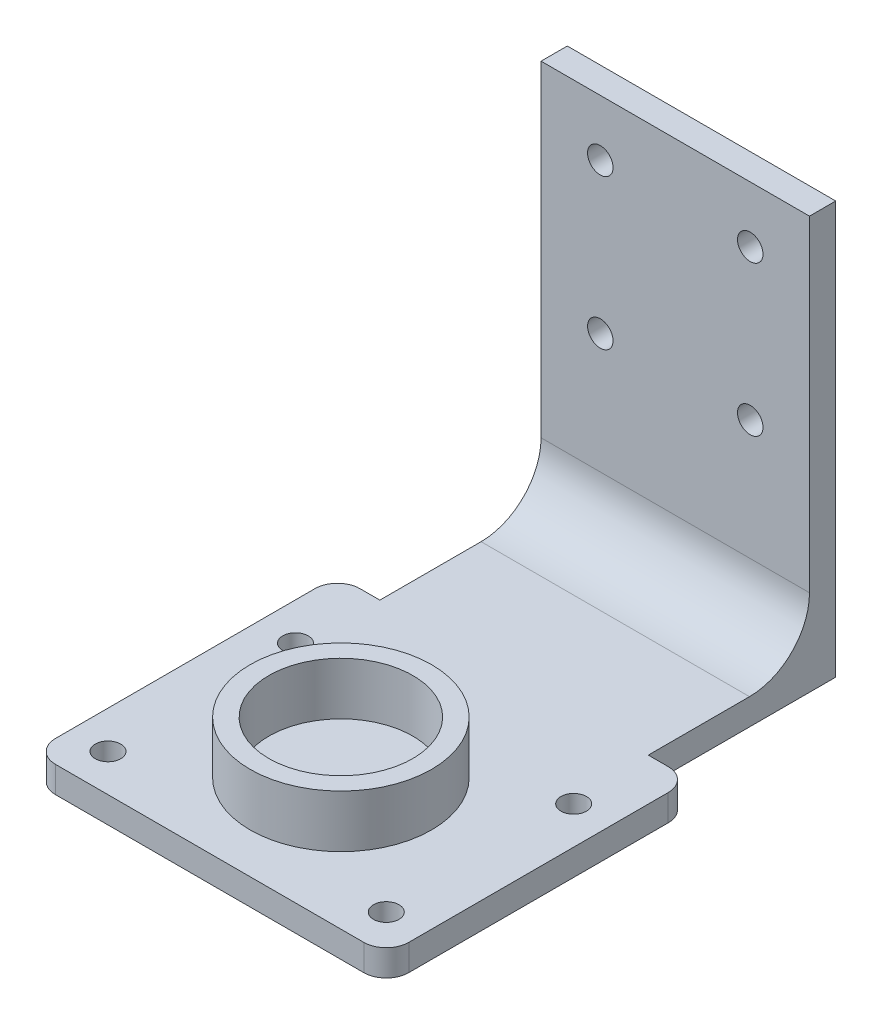
ISO-10303-21;
HEADER;
FILE_DESCRIPTION(('STEP AP214'),'2;1');
FILE_NAME('part.step','',(''),(''),'','','');
FILE_SCHEMA(('AUTOMOTIVE_DESIGN { 1 0 10303 214 1 1 1 1 }'));
ENDSEC;
DATA;
#1=APPLICATION_CONTEXT('core data for automotive mechanical design processes');
#2=APPLICATION_PROTOCOL_DEFINITION('international standard','automotive_design',2000,#1);
#3=PRODUCT_CONTEXT('',#1,'mechanical');
#4=PRODUCT('Part','Part','',(#3));
#5=PRODUCT_RELATED_PRODUCT_CATEGORY('part','',(#4));
#6=PRODUCT_DEFINITION_FORMATION('','',#4);
#7=PRODUCT_DEFINITION_CONTEXT('part definition',#1,'design');
#8=PRODUCT_DEFINITION('design','',#6,#7);
#9=PRODUCT_DEFINITION_SHAPE('','',#8);
#10=(LENGTH_UNIT() NAMED_UNIT(*) SI_UNIT(.MILLI.,.METRE.));
#11=(NAMED_UNIT(*) PLANE_ANGLE_UNIT() SI_UNIT($,.RADIAN.));
#12=(NAMED_UNIT(*) SI_UNIT($,.STERADIAN.) SOLID_ANGLE_UNIT());
#13=UNCERTAINTY_MEASURE_WITH_UNIT(LENGTH_MEASURE(1.E-05),#10,'distance_accuracy_value','');
#14=(GEOMETRIC_REPRESENTATION_CONTEXT(3) GLOBAL_UNCERTAINTY_ASSIGNED_CONTEXT((#13)) GLOBAL_UNIT_ASSIGNED_CONTEXT((#10,
#11,#12)) REPRESENTATION_CONTEXT('',''));
#15=CARTESIAN_POINT('',(0.,0.,0.));
#16=DIRECTION('',(0.,0.,1.));
#17=DIRECTION('',(1.,0.,0.));
#18=AXIS2_PLACEMENT_3D('',#15,#16,#17);
#19=CARTESIAN_POINT('',(0.,3.5,0.));
#20=DIRECTION('',(0.,-1.,0.));
#21=DIRECTION('',(0.,0.,-1.));
#22=AXIS2_PLACEMENT_3D('',#19,#20,#21);
#23=PLANE('',#22);
#24=CARTESIAN_POINT('',(0.,3.5,0.));
#25=DIRECTION('',(0.,-1.,0.));
#26=DIRECTION('',(0.,0.,-1.));
#27=AXIS2_PLACEMENT_3D('',#24,#25,#26);
#28=CIRCLE('',#27,12.1);
#29=CARTESIAN_POINT('',(0.,3.5,-12.1));
#30=VERTEX_POINT('',#29);
#31=EDGE_CURVE('E270',#30,#30,#28,.F.);
#32=ORIENTED_EDGE('',*,*,#31,.F.);
#33=EDGE_LOOP('',(#32));
#34=FACE_BOUND('',#33,.T.);
#35=DIRECTION('',(0.,0.,-1.));
#36=VECTOR('',#35,1.);
#37=CARTESIAN_POINT('',(17.9,3.5,0.));
#38=LINE('',#37,#36);
#39=CARTESIAN_POINT('',(17.9,3.5,-23.1));
#40=VERTEX_POINT('',#39);
#41=CARTESIAN_POINT('',(17.9,3.5,-36.6));
#42=VERTEX_POINT('',#41);
#43=EDGE_CURVE('E148',#40,#42,#38,.T.);
#44=ORIENTED_EDGE('',*,*,#43,.T.);
#45=DIRECTION('',(-1.,0.,0.));
#46=VECTOR('',#45,1.);
#47=CARTESIAN_POINT('',(0.,3.5,-36.6));
#48=LINE('',#47,#46);
#49=CARTESIAN_POINT('',(-17.9,3.5,-36.6));
#50=VERTEX_POINT('',#49);
#51=EDGE_CURVE('E315',#42,#50,#48,.T.);
#52=ORIENTED_EDGE('',*,*,#51,.T.);
#53=DIRECTION('',(0.,0.,1.));
#54=VECTOR('',#53,1.);
#55=CARTESIAN_POINT('',(-17.9,3.5,0.));
#56=LINE('',#55,#54);
#57=CARTESIAN_POINT('',(-17.9,3.5,-23.1));
#58=VERTEX_POINT('',#57);
#59=EDGE_CURVE('E190',#50,#58,#56,.T.);
#60=ORIENTED_EDGE('',*,*,#59,.T.);
#61=DIRECTION('',(-1.,0.,0.));
#62=VECTOR('',#61,1.);
#63=CARTESIAN_POINT('',(0.,3.5,-23.1));
#64=LINE('',#63,#62);
#65=CARTESIAN_POINT('',(-20.555,3.5,-23.1));
#66=VERTEX_POINT('',#65);
#67=EDGE_CURVE('E192',#58,#66,#64,.T.);
#68=ORIENTED_EDGE('',*,*,#67,.T.);
#69=CARTESIAN_POINT('',(-20.555,3.5,-20.1));
#70=DIRECTION('',(0.,-1.,0.));
#71=DIRECTION('',(0.,0.,-1.));
#72=AXIS2_PLACEMENT_3D('',#69,#70,#71);
#73=CIRCLE('',#72,3.);
#74=CARTESIAN_POINT('',(-23.555,3.5,-20.1));
#75=VERTEX_POINT('',#74);
#76=EDGE_CURVE('E288',#66,#75,#73,.F.);
#77=ORIENTED_EDGE('',*,*,#76,.T.);
#78=DIRECTION('',(0.,0.,1.));
#79=VECTOR('',#78,1.);
#80=CARTESIAN_POINT('',(-23.555,3.5,-17.5));
#81=LINE('',#80,#79);
#82=CARTESIAN_POINT('',(-23.555,3.5,14.5));
#83=VERTEX_POINT('',#82);
#84=EDGE_CURVE('E260',#75,#83,#81,.T.);
#85=ORIENTED_EDGE('',*,*,#84,.T.);
#86=CARTESIAN_POINT('',(-20.555,3.5,14.5));
#87=DIRECTION('',(0.,-1.,0.));
#88=DIRECTION('',(0.,0.,-1.));
#89=AXIS2_PLACEMENT_3D('',#86,#87,#88);
#90=CIRCLE('',#89,3.);
#91=CARTESIAN_POINT('',(-20.555,3.5,17.5));
#92=VERTEX_POINT('',#91);
#93=EDGE_CURVE('E286',#83,#92,#90,.F.);
#94=ORIENTED_EDGE('',*,*,#93,.T.);
#95=DIRECTION('',(1.,0.,0.));
#96=VECTOR('',#95,1.);
#97=CARTESIAN_POINT('',(-23.555,3.5,17.5));
#98=LINE('',#97,#96);
#99=CARTESIAN_POINT('',(20.555,3.5,17.5));
#100=VERTEX_POINT('',#99);
#101=EDGE_CURVE('E263',#92,#100,#98,.T.);
#102=ORIENTED_EDGE('',*,*,#101,.T.);
#103=CARTESIAN_POINT('',(20.555,3.5,14.5));
#104=DIRECTION('',(0.,-1.,0.));
#105=DIRECTION('',(0.,0.,-1.));
#106=AXIS2_PLACEMENT_3D('',#103,#104,#105);
#107=CIRCLE('',#106,3.);
#108=CARTESIAN_POINT('',(23.555,3.5,14.5));
#109=VERTEX_POINT('',#108);
#110=EDGE_CURVE('E290',#100,#109,#107,.F.);
#111=ORIENTED_EDGE('',*,*,#110,.T.);
#112=DIRECTION('',(0.,0.,-1.));
#113=VECTOR('',#112,1.);
#114=CARTESIAN_POINT('',(23.555,3.5,-17.5));
#115=LINE('',#114,#113);
#116=CARTESIAN_POINT('',(23.555,3.5,-20.1));
#117=VERTEX_POINT('',#116);
#118=EDGE_CURVE('E267',#109,#117,#115,.T.);
#119=ORIENTED_EDGE('',*,*,#118,.T.);
#120=CARTESIAN_POINT('',(20.555,3.5,-20.1));
#121=DIRECTION('',(0.,-1.,0.));
#122=DIRECTION('',(0.,0.,-1.));
#123=AXIS2_PLACEMENT_3D('',#120,#121,#122);
#124=CIRCLE('',#123,3.);
#125=CARTESIAN_POINT('',(20.555,3.5,-23.1));
#126=VERTEX_POINT('',#125);
#127=EDGE_CURVE('E292',#117,#126,#124,.F.);
#128=ORIENTED_EDGE('',*,*,#127,.T.);
#129=DIRECTION('',(-1.,0.,0.));
#130=VECTOR('',#129,1.);
#131=CARTESIAN_POINT('',(0.,3.5,-23.1));
#132=LINE('',#131,#130);
#133=EDGE_CURVE('E174',#126,#40,#132,.T.);
#134=ORIENTED_EDGE('',*,*,#133,.T.);
#135=EDGE_LOOP('',(#44,#52,#60,#68,#77,#85,#94,#102,#111,#119,#128,#134));
#136=FACE_BOUND('',#135,.T.);
#137=CARTESIAN_POINT('',(-18.555,3.5,12.5));
#138=DIRECTION('',(0.,1.,0.));
#139=DIRECTION('',(0.,0.,1.));
#140=AXIS2_PLACEMENT_3D('',#137,#138,#139);
#141=CIRCLE('',#140,1.7);
#142=CARTESIAN_POINT('',(-18.555,3.5,14.2));
#143=VERTEX_POINT('',#142);
#144=EDGE_CURVE('E254',#143,#143,#141,.T.);
#145=ORIENTED_EDGE('',*,*,#144,.F.);
#146=EDGE_LOOP('',(#145));
#147=FACE_BOUND('',#146,.T.);
#148=CARTESIAN_POINT('',(-18.555,3.5,-12.5));
#149=DIRECTION('',(0.,1.,0.));
#150=DIRECTION('',(0.,0.,-1.));
#151=AXIS2_PLACEMENT_3D('',#148,#149,#150);
#152=CIRCLE('',#151,1.7);
#153=CARTESIAN_POINT('',(-18.555,3.5,-14.2));
#154=VERTEX_POINT('',#153);
#155=EDGE_CURVE('E248',#154,#154,#152,.T.);
#156=ORIENTED_EDGE('',*,*,#155,.F.);
#157=EDGE_LOOP('',(#156));
#158=FACE_BOUND('',#157,.T.);
#159=CARTESIAN_POINT('',(18.555,3.5,12.5));
#160=DIRECTION('',(0.,1.,0.));
#161=DIRECTION('',(0.,0.,-1.));
#162=AXIS2_PLACEMENT_3D('',#159,#160,#161);
#163=CIRCLE('',#162,1.7);
#164=CARTESIAN_POINT('',(18.555,3.5,10.8));
#165=VERTEX_POINT('',#164);
#166=EDGE_CURVE('E242',#165,#165,#163,.T.);
#167=ORIENTED_EDGE('',*,*,#166,.F.);
#168=EDGE_LOOP('',(#167));
#169=FACE_BOUND('',#168,.T.);
#170=CARTESIAN_POINT('',(18.555,3.5,-12.5));
#171=DIRECTION('',(0.,1.,0.));
#172=DIRECTION('',(0.,0.,1.));
#173=AXIS2_PLACEMENT_3D('',#170,#171,#172);
#174=CIRCLE('',#173,1.7);
#175=CARTESIAN_POINT('',(18.555,3.5,-10.8));
#176=VERTEX_POINT('',#175);
#177=EDGE_CURVE('E236',#176,#176,#174,.T.);
#178=ORIENTED_EDGE('',*,*,#177,.F.);
#179=EDGE_LOOP('',(#178));
#180=FACE_BOUND('',#179,.T.);
#181=ADVANCED_FACE('F35',(#34,#136,#147,#158,#169,#180),#23,.F.);
#182=CARTESIAN_POINT('',(0.,0.,0.));
#183=DIRECTION('',(0.,-1.,0.));
#184=DIRECTION('',(0.,0.,-1.));
#185=AXIS2_PLACEMENT_3D('',#182,#183,#184);
#186=PLANE('',#185);
#187=DIRECTION('',(1.,0.,0.));
#188=VECTOR('',#187,1.);
#189=CARTESIAN_POINT('',(23.555,0.,-23.1));
#190=LINE('',#189,#188);
#191=CARTESIAN_POINT('',(17.9,0.,-23.1));
#192=VERTEX_POINT('',#191);
#193=CARTESIAN_POINT('',(20.555,0.,-23.1));
#194=VERTEX_POINT('',#193);
#195=EDGE_CURVE('E155',#192,#194,#190,.T.);
#196=ORIENTED_EDGE('',*,*,#195,.T.);
#197=CARTESIAN_POINT('',(20.555,0.,-20.1));
#198=DIRECTION('',(0.,-1.,0.));
#199=DIRECTION('',(0.,0.,-1.));
#200=AXIS2_PLACEMENT_3D('',#197,#198,#199);
#201=CIRCLE('',#200,3.);
#202=CARTESIAN_POINT('',(23.555,0.,-20.1));
#203=VERTEX_POINT('',#202);
#204=EDGE_CURVE('E301',#194,#203,#201,.T.);
#205=ORIENTED_EDGE('',*,*,#204,.T.);
#206=DIRECTION('',(0.,0.,-1.));
#207=VECTOR('',#206,1.);
#208=CARTESIAN_POINT('',(23.555,0.,-44.6));
#209=LINE('',#208,#207);
#210=CARTESIAN_POINT('',(23.555,0.,14.5));
#211=VERTEX_POINT('',#210);
#212=EDGE_CURVE('E264',#211,#203,#209,.T.);
#213=ORIENTED_EDGE('',*,*,#212,.F.);
#214=CARTESIAN_POINT('',(20.555,0.,14.5));
#215=DIRECTION('',(0.,-1.,0.));
#216=DIRECTION('',(0.,0.,-1.));
#217=AXIS2_PLACEMENT_3D('',#214,#215,#216);
#218=CIRCLE('',#217,3.);
#219=CARTESIAN_POINT('',(20.555,0.,17.5));
#220=VERTEX_POINT('',#219);
#221=EDGE_CURVE('E299',#211,#220,#218,.T.);
#222=ORIENTED_EDGE('',*,*,#221,.T.);
#223=DIRECTION('',(1.,0.,0.));
#224=VECTOR('',#223,1.);
#225=CARTESIAN_POINT('',(-23.555,0.,17.5));
#226=LINE('',#225,#224);
#227=CARTESIAN_POINT('',(-20.555,0.,17.5));
#228=VERTEX_POINT('',#227);
#229=EDGE_CURVE('E273',#228,#220,#226,.T.);
#230=ORIENTED_EDGE('',*,*,#229,.F.);
#231=CARTESIAN_POINT('',(-20.555,0.,14.5));
#232=DIRECTION('',(0.,-1.,0.));
#233=DIRECTION('',(0.,0.,-1.));
#234=AXIS2_PLACEMENT_3D('',#231,#232,#233);
#235=CIRCLE('',#234,3.);
#236=CARTESIAN_POINT('',(-23.555,0.,14.5));
#237=VERTEX_POINT('',#236);
#238=EDGE_CURVE('E295',#228,#237,#235,.T.);
#239=ORIENTED_EDGE('',*,*,#238,.T.);
#240=DIRECTION('',(0.,0.,1.));
#241=VECTOR('',#240,1.);
#242=CARTESIAN_POINT('',(-23.555,0.,-17.5));
#243=LINE('',#242,#241);
#244=CARTESIAN_POINT('',(-23.555,0.,-20.1));
#245=VERTEX_POINT('',#244);
#246=EDGE_CURVE('E257',#245,#237,#243,.T.);
#247=ORIENTED_EDGE('',*,*,#246,.F.);
#248=CARTESIAN_POINT('',(-20.555,0.,-20.1));
#249=DIRECTION('',(0.,-1.,0.));
#250=DIRECTION('',(0.,0.,-1.));
#251=AXIS2_PLACEMENT_3D('',#248,#249,#250);
#252=CIRCLE('',#251,3.);
#253=CARTESIAN_POINT('',(-20.555,0.,-23.1));
#254=VERTEX_POINT('',#253);
#255=EDGE_CURVE('E297',#245,#254,#252,.T.);
#256=ORIENTED_EDGE('',*,*,#255,.T.);
#257=DIRECTION('',(1.,0.,0.));
#258=VECTOR('',#257,1.);
#259=CARTESIAN_POINT('',(-23.555,0.,-23.1));
#260=LINE('',#259,#258);
#261=CARTESIAN_POINT('',(-17.9,0.,-23.1));
#262=VERTEX_POINT('',#261);
#263=EDGE_CURVE('E177',#254,#262,#260,.T.);
#264=ORIENTED_EDGE('',*,*,#263,.T.);
#265=DIRECTION('',(0.,0.,-1.));
#266=VECTOR('',#265,1.);
#267=CARTESIAN_POINT('',(-17.9,0.,-23.1));
#268=LINE('',#267,#266);
#269=CARTESIAN_POINT('',(-17.9,0.,-48.1));
#270=VERTEX_POINT('',#269);
#271=EDGE_CURVE('E179',#262,#270,#268,.T.);
#272=ORIENTED_EDGE('',*,*,#271,.T.);
#273=DIRECTION('',(-1.,0.,0.));
#274=VECTOR('',#273,1.);
#275=CARTESIAN_POINT('',(-23.555,0.,-48.1));
#276=LINE('',#275,#274);
#277=CARTESIAN_POINT('',(17.9,0.,-48.1));
#278=VERTEX_POINT('',#277);
#279=EDGE_CURVE('E166',#278,#270,#276,.T.);
#280=ORIENTED_EDGE('',*,*,#279,.F.);
#281=DIRECTION('',(0.,0.,1.));
#282=VECTOR('',#281,1.);
#283=CARTESIAN_POINT('',(17.9,0.,-23.1));
#284=LINE('',#283,#282);
#285=EDGE_CURVE('E145',#278,#192,#284,.T.);
#286=ORIENTED_EDGE('',*,*,#285,.T.);
#287=EDGE_LOOP('',(#196,#205,#213,#222,#230,#239,#247,#256,#264,#272,#280,#286));
#288=FACE_BOUND('',#287,.T.);
#289=CARTESIAN_POINT('',(18.555,0.,12.5));
#290=DIRECTION('',(0.,1.,0.));
#291=DIRECTION('',(0.,0.,-1.));
#292=AXIS2_PLACEMENT_3D('',#289,#290,#291);
#293=CIRCLE('',#292,1.7);
#294=CARTESIAN_POINT('',(18.555,0.,10.8));
#295=VERTEX_POINT('',#294);
#296=EDGE_CURVE('E239',#295,#295,#293,.T.);
#297=ORIENTED_EDGE('',*,*,#296,.T.);
#298=EDGE_LOOP('',(#297));
#299=FACE_BOUND('',#298,.T.);
#300=CARTESIAN_POINT('',(-18.555,0.,12.5));
#301=DIRECTION('',(0.,1.,0.));
#302=DIRECTION('',(0.,0.,1.));
#303=AXIS2_PLACEMENT_3D('',#300,#301,#302);
#304=CIRCLE('',#303,1.7);
#305=CARTESIAN_POINT('',(-18.555,0.,14.2));
#306=VERTEX_POINT('',#305);
#307=EDGE_CURVE('E251',#306,#306,#304,.T.);
#308=ORIENTED_EDGE('',*,*,#307,.T.);
#309=EDGE_LOOP('',(#308));
#310=FACE_BOUND('',#309,.T.);
#311=CARTESIAN_POINT('',(-18.555,0.,-12.5));
#312=DIRECTION('',(0.,1.,0.));
#313=DIRECTION('',(0.,0.,-1.));
#314=AXIS2_PLACEMENT_3D('',#311,#312,#313);
#315=CIRCLE('',#314,1.7);
#316=CARTESIAN_POINT('',(-18.555,0.,-14.2));
#317=VERTEX_POINT('',#316);
#318=EDGE_CURVE('E245',#317,#317,#315,.T.);
#319=ORIENTED_EDGE('',*,*,#318,.T.);
#320=EDGE_LOOP('',(#319));
#321=FACE_BOUND('',#320,.T.);
#322=CARTESIAN_POINT('',(18.555,0.,-12.5));
#323=DIRECTION('',(0.,1.,0.));
#324=DIRECTION('',(0.,0.,1.));
#325=AXIS2_PLACEMENT_3D('',#322,#323,#324);
#326=CIRCLE('',#325,1.7);
#327=CARTESIAN_POINT('',(18.555,0.,-10.8));
#328=VERTEX_POINT('',#327);
#329=EDGE_CURVE('E235',#328,#328,#326,.T.);
#330=ORIENTED_EDGE('',*,*,#329,.T.);
#331=EDGE_LOOP('',(#330));
#332=FACE_BOUND('',#331,.T.);
#333=ADVANCED_FACE('F163',(#288,#299,#310,#321,#332),#186,.T.);
#334=CARTESIAN_POINT('',(-23.555,3.5,-17.5));
#335=DIRECTION('',(1.,0.,0.));
#336=DIRECTION('',(0.,0.,-1.));
#337=AXIS2_PLACEMENT_3D('',#334,#335,#336);
#338=PLANE('',#337);
#339=ORIENTED_EDGE('',*,*,#84,.F.);
#340=DIRECTION('',(0.,1.,0.));
#341=VECTOR('',#340,1.);
#342=CARTESIAN_POINT('',(-23.555,3.5,-20.1));
#343=LINE('',#342,#341);
#344=EDGE_CURVE('E313',#75,#245,#343,.F.);
#345=ORIENTED_EDGE('',*,*,#344,.T.);
#346=ORIENTED_EDGE('',*,*,#246,.T.);
#347=DIRECTION('',(0.,-1.,0.));
#348=VECTOR('',#347,1.);
#349=CARTESIAN_POINT('',(-23.555,3.5,14.5));
#350=LINE('',#349,#348);
#351=EDGE_CURVE('E311',#237,#83,#350,.F.);
#352=ORIENTED_EDGE('',*,*,#351,.T.);
#353=EDGE_LOOP('',(#339,#345,#346,#352));
#354=FACE_BOUND('',#353,.T.);
#355=ADVANCED_FACE('F337',(#354),#338,.F.);
#356=CARTESIAN_POINT('',(-23.555,3.5,17.5));
#357=DIRECTION('',(0.,0.,-1.));
#358=DIRECTION('',(-1.,0.,0.));
#359=AXIS2_PLACEMENT_3D('',#356,#357,#358);
#360=PLANE('',#359);
#361=ORIENTED_EDGE('',*,*,#229,.T.);
#362=DIRECTION('',(0.,-1.,0.));
#363=VECTOR('',#362,1.);
#364=CARTESIAN_POINT('',(20.555,3.5,17.5));
#365=LINE('',#364,#363);
#366=EDGE_CURVE('E306',#220,#100,#365,.F.);
#367=ORIENTED_EDGE('',*,*,#366,.T.);
#368=ORIENTED_EDGE('',*,*,#101,.F.);
#369=DIRECTION('',(0.,-1.,0.));
#370=VECTOR('',#369,1.);
#371=CARTESIAN_POINT('',(-20.555,3.5,17.5));
#372=LINE('',#371,#370);
#373=EDGE_CURVE('E303',#92,#228,#372,.T.);
#374=ORIENTED_EDGE('',*,*,#373,.T.);
#375=EDGE_LOOP('',(#361,#367,#368,#374));
#376=FACE_BOUND('',#375,.T.);
#377=ADVANCED_FACE('F349',(#376),#360,.F.);
#378=CARTESIAN_POINT('',(23.555,3.5,-44.6));
#379=DIRECTION('',(-1.,0.,0.));
#380=DIRECTION('',(0.,0.,1.));
#381=AXIS2_PLACEMENT_3D('',#378,#379,#380);
#382=PLANE('',#381);
#383=ORIENTED_EDGE('',*,*,#212,.T.);
#384=DIRECTION('',(0.,1.,0.));
#385=VECTOR('',#384,1.);
#386=CARTESIAN_POINT('',(23.555,3.5,-20.1));
#387=LINE('',#386,#385);
#388=EDGE_CURVE('E283',#203,#117,#387,.T.);
#389=ORIENTED_EDGE('',*,*,#388,.T.);
#390=ORIENTED_EDGE('',*,*,#118,.F.);
#391=DIRECTION('',(0.,-1.,0.));
#392=VECTOR('',#391,1.);
#393=CARTESIAN_POINT('',(23.555,3.5,14.5));
#394=LINE('',#393,#392);
#395=EDGE_CURVE('E280',#109,#211,#394,.T.);
#396=ORIENTED_EDGE('',*,*,#395,.T.);
#397=EDGE_LOOP('',(#383,#389,#390,#396));
#398=FACE_BOUND('',#397,.T.);
#399=ADVANCED_FACE('F356',(#398),#382,.F.);
#400=CARTESIAN_POINT('',(-18.555,3.5,12.5));
#401=DIRECTION('',(0.,-1.,0.));
#402=DIRECTION('',(0.,0.,-1.));
#403=AXIS2_PLACEMENT_3D('',#400,#401,#402);
#404=CYLINDRICAL_SURFACE('',#403,1.7);
#405=ORIENTED_EDGE('',*,*,#144,.T.);
#406=EDGE_LOOP('',(#405));
#407=FACE_BOUND('',#406,.T.);
#408=ORIENTED_EDGE('',*,*,#307,.F.);
#409=EDGE_LOOP('',(#408));
#410=FACE_BOUND('',#409,.T.);
#411=ADVANCED_FACE('F416',(#407,#410),#404,.F.);
#412=CARTESIAN_POINT('',(-18.555,3.5,-12.5));
#413=DIRECTION('',(0.,-1.,0.));
#414=DIRECTION('',(0.,0.,-1.));
#415=AXIS2_PLACEMENT_3D('',#412,#413,#414);
#416=CYLINDRICAL_SURFACE('',#415,1.7);
#417=ORIENTED_EDGE('',*,*,#155,.T.);
#418=EDGE_LOOP('',(#417));
#419=FACE_BOUND('',#418,.T.);
#420=ORIENTED_EDGE('',*,*,#318,.F.);
#421=EDGE_LOOP('',(#420));
#422=FACE_BOUND('',#421,.T.);
#423=ADVANCED_FACE('F413',(#419,#422),#416,.F.);
#424=CARTESIAN_POINT('',(18.555,3.5,12.5));
#425=DIRECTION('',(0.,-1.,0.));
#426=DIRECTION('',(0.,0.,-1.));
#427=AXIS2_PLACEMENT_3D('',#424,#425,#426);
#428=CYLINDRICAL_SURFACE('',#427,1.7);
#429=ORIENTED_EDGE('',*,*,#166,.T.);
#430=EDGE_LOOP('',(#429));
#431=FACE_BOUND('',#430,.T.);
#432=ORIENTED_EDGE('',*,*,#296,.F.);
#433=EDGE_LOOP('',(#432));
#434=FACE_BOUND('',#433,.T.);
#435=ADVANCED_FACE('F409',(#431,#434),#428,.F.);
#436=CARTESIAN_POINT('',(18.555,3.5,-12.5));
#437=DIRECTION('',(0.,-1.,0.));
#438=DIRECTION('',(0.,0.,-1.));
#439=AXIS2_PLACEMENT_3D('',#436,#437,#438);
#440=CYLINDRICAL_SURFACE('',#439,1.7);
#441=ORIENTED_EDGE('',*,*,#177,.T.);
#442=EDGE_LOOP('',(#441));
#443=FACE_BOUND('',#442,.T.);
#444=ORIENTED_EDGE('',*,*,#329,.F.);
#445=EDGE_LOOP('',(#444));
#446=FACE_BOUND('',#445,.T.);
#447=ADVANCED_FACE('F404',(#443,#446),#440,.F.);
#448=CARTESIAN_POINT('',(0.,10.5,0.));
#449=DIRECTION('',(0.,1.,0.));
#450=DIRECTION('',(0.,0.,1.));
#451=AXIS2_PLACEMENT_3D('',#448,#449,#450);
#452=PLANE('',#451);
#453=CARTESIAN_POINT('',(0.,10.5,0.));
#454=DIRECTION('',(0.,1.,0.));
#455=DIRECTION('',(0.,0.,1.));
#456=AXIS2_PLACEMENT_3D('',#453,#454,#455);
#457=CIRCLE('',#456,12.1);
#458=CARTESIAN_POINT('',(0.,10.5,12.1));
#459=VERTEX_POINT('',#458);
#460=EDGE_CURVE('E230',#459,#459,#457,.T.);
#461=ORIENTED_EDGE('',*,*,#460,.T.);
#462=EDGE_LOOP('',(#461));
#463=FACE_BOUND('',#462,.T.);
#464=CARTESIAN_POINT('',(0.,10.5,0.));
#465=DIRECTION('',(0.,1.,0.));
#466=DIRECTION('',(0.,0.,1.));
#467=AXIS2_PLACEMENT_3D('',#464,#465,#466);
#468=CIRCLE('',#467,9.6);
#469=CARTESIAN_POINT('',(0.,10.5,9.6));
#470=VERTEX_POINT('',#469);
#471=EDGE_CURVE('E227',#470,#470,#468,.T.);
#472=ORIENTED_EDGE('',*,*,#471,.F.);
#473=EDGE_LOOP('',(#472));
#474=FACE_BOUND('',#473,.T.);
#475=ADVANCED_FACE('F398',(#463,#474),#452,.T.);
#476=CARTESIAN_POINT('',(0.,10.5,0.));
#477=DIRECTION('',(0.,-1.,0.));
#478=DIRECTION('',(0.,0.,-1.));
#479=AXIS2_PLACEMENT_3D('',#476,#477,#478);
#480=CYLINDRICAL_SURFACE('',#479,12.1);
#481=ORIENTED_EDGE('',*,*,#460,.F.);
#482=EDGE_LOOP('',(#481));
#483=FACE_BOUND('',#482,.T.);
#484=ORIENTED_EDGE('',*,*,#31,.T.);
#485=EDGE_LOOP('',(#484));
#486=FACE_BOUND('',#485,.T.);
#487=ADVANCED_FACE('F390',(#483,#486),#480,.T.);
#488=CARTESIAN_POINT('',(0.,10.5,0.));
#489=DIRECTION('',(0.,-1.,0.));
#490=DIRECTION('',(0.,0.,-1.));
#491=AXIS2_PLACEMENT_3D('',#488,#489,#490);
#492=CYLINDRICAL_SURFACE('',#491,9.6);
#493=ORIENTED_EDGE('',*,*,#471,.T.);
#494=EDGE_LOOP('',(#493));
#495=FACE_BOUND('',#494,.T.);
#496=CARTESIAN_POINT('',(0.,3.5,0.));
#497=DIRECTION('',(0.,1.,0.));
#498=DIRECTION('',(0.,0.,1.));
#499=AXIS2_PLACEMENT_3D('',#496,#497,#498);
#500=CIRCLE('',#499,9.6);
#501=CARTESIAN_POINT('',(0.,3.5,9.6));
#502=VERTEX_POINT('',#501);
#503=EDGE_CURVE('E224',#502,#502,#500,.T.);
#504=ORIENTED_EDGE('',*,*,#503,.F.);
#505=EDGE_LOOP('',(#504));
#506=FACE_BOUND('',#505,.T.);
#507=ADVANCED_FACE('F382',(#495,#506),#492,.F.);
#508=ORIENTED_EDGE('',*,*,#503,.T.);
#509=EDGE_LOOP('',(#508));
#510=FACE_BOUND('',#509,.T.);
#511=ADVANCED_FACE('F373',(#510),#23,.F.);
#512=CARTESIAN_POINT('',(0.,0.,-44.6));
#513=DIRECTION('',(0.,0.,1.));
#514=DIRECTION('',(1.,0.,0.));
#515=AXIS2_PLACEMENT_3D('',#512,#513,#514);
#516=PLANE('',#515);
#517=DIRECTION('',(0.,1.,0.));
#518=VECTOR('',#517,1.);
#519=CARTESIAN_POINT('',(-17.9,0.,-44.6));
#520=LINE('',#519,#518);
#521=CARTESIAN_POINT('',(-17.9,11.5,-44.6));
#522=VERTEX_POINT('',#521);
#523=CARTESIAN_POINT('',(-17.9,55.,-44.6));
#524=VERTEX_POINT('',#523);
#525=EDGE_CURVE('E186',#522,#524,#520,.T.);
#526=ORIENTED_EDGE('',*,*,#525,.F.);
#527=DIRECTION('',(-1.,0.,0.));
#528=VECTOR('',#527,1.);
#529=CARTESIAN_POINT('',(0.,11.5,-44.6));
#530=LINE('',#529,#528);
#531=CARTESIAN_POINT('',(17.9,11.5,-44.6));
#532=VERTEX_POINT('',#531);
#533=EDGE_CURVE('E56',#522,#532,#530,.F.);
#534=ORIENTED_EDGE('',*,*,#533,.T.);
#535=DIRECTION('',(0.,-1.,0.));
#536=VECTOR('',#535,1.);
#537=CARTESIAN_POINT('',(17.9,0.,-44.6));
#538=LINE('',#537,#536);
#539=CARTESIAN_POINT('',(17.9,55.,-44.6));
#540=VERTEX_POINT('',#539);
#541=EDGE_CURVE('E151',#540,#532,#538,.T.);
#542=ORIENTED_EDGE('',*,*,#541,.F.);
#543=DIRECTION('',(1.,0.,0.));
#544=VECTOR('',#543,1.);
#545=CARTESIAN_POINT('',(23.555,55.,-44.6));
#546=LINE('',#545,#544);
#547=EDGE_CURVE('E219',#524,#540,#546,.T.);
#548=ORIENTED_EDGE('',*,*,#547,.F.);
#549=EDGE_LOOP('',(#526,#534,#542,#548));
#550=FACE_BOUND('',#549,.T.);
#551=CARTESIAN_POINT('',(10.,47.5,-44.6));
#552=DIRECTION('',(0.,0.,1.));
#553=DIRECTION('',(1.,0.,0.));
#554=AXIS2_PLACEMENT_3D('',#551,#552,#553);
#555=CIRCLE('',#554,1.7);
#556=CARTESIAN_POINT('',(11.7,47.5,-44.6));
#557=VERTEX_POINT('',#556);
#558=EDGE_CURVE('E210',#557,#557,#555,.T.);
#559=ORIENTED_EDGE('',*,*,#558,.F.);
#560=EDGE_LOOP('',(#559));
#561=FACE_BOUND('',#560,.T.);
#562=CARTESIAN_POINT('',(-10.,27.5,-44.6));
#563=DIRECTION('',(0.,0.,1.));
#564=DIRECTION('',(1.,0.,0.));
#565=AXIS2_PLACEMENT_3D('',#562,#563,#564);
#566=CIRCLE('',#565,1.7);
#567=CARTESIAN_POINT('',(-8.3,27.5,-44.6));
#568=VERTEX_POINT('',#567);
#569=EDGE_CURVE('E207',#568,#568,#566,.T.);
#570=ORIENTED_EDGE('',*,*,#569,.F.);
#571=EDGE_LOOP('',(#570));
#572=FACE_BOUND('',#571,.T.);
#573=CARTESIAN_POINT('',(-10.,47.5,-44.6));
#574=DIRECTION('',(0.,0.,1.));
#575=DIRECTION('',(1.,0.,0.));
#576=AXIS2_PLACEMENT_3D('',#573,#574,#575);
#577=CIRCLE('',#576,1.7);
#578=CARTESIAN_POINT('',(-8.3,47.5,-44.6));
#579=VERTEX_POINT('',#578);
#580=EDGE_CURVE('E199',#579,#579,#577,.T.);
#581=ORIENTED_EDGE('',*,*,#580,.F.);
#582=EDGE_LOOP('',(#581));
#583=FACE_BOUND('',#582,.T.);
#584=CARTESIAN_POINT('',(10.,27.5,-44.6));
#585=DIRECTION('',(0.,0.,1.));
#586=DIRECTION('',(1.,0.,0.));
#587=AXIS2_PLACEMENT_3D('',#584,#585,#586);
#588=CIRCLE('',#587,1.7);
#589=CARTESIAN_POINT('',(11.7,27.5,-44.6));
#590=VERTEX_POINT('',#589);
#591=EDGE_CURVE('E216',#590,#590,#588,.T.);
#592=ORIENTED_EDGE('',*,*,#591,.F.);
#593=EDGE_LOOP('',(#592));
#594=FACE_BOUND('',#593,.T.);
#595=ADVANCED_FACE('F381',(#550,#561,#572,#583,#594),#516,.T.);
#596=CARTESIAN_POINT('',(23.555,55.,-48.1));
#597=DIRECTION('',(0.,-1.,0.));
#598=DIRECTION('',(0.,0.,-1.));
#599=AXIS2_PLACEMENT_3D('',#596,#597,#598);
#600=PLANE('',#599);
#601=ORIENTED_EDGE('',*,*,#547,.T.);
#602=DIRECTION('',(0.,0.,1.));
#603=VECTOR('',#602,1.);
#604=CARTESIAN_POINT('',(17.9,55.,-23.1));
#605=LINE('',#604,#603);
#606=CARTESIAN_POINT('',(17.9,55.,-48.1));
#607=VERTEX_POINT('',#606);
#608=EDGE_CURVE('E167',#607,#540,#605,.T.);
#609=ORIENTED_EDGE('',*,*,#608,.F.);
#610=DIRECTION('',(1.,0.,0.));
#611=VECTOR('',#610,1.);
#612=CARTESIAN_POINT('',(23.555,55.,-48.1));
#613=LINE('',#612,#611);
#614=CARTESIAN_POINT('',(-17.9,55.,-48.1));
#615=VERTEX_POINT('',#614);
#616=EDGE_CURVE('E221',#615,#607,#613,.T.);
#617=ORIENTED_EDGE('',*,*,#616,.F.);
#618=DIRECTION('',(0.,0.,-1.));
#619=VECTOR('',#618,1.);
#620=CARTESIAN_POINT('',(-17.9,55.,-23.1));
#621=LINE('',#620,#619);
#622=EDGE_CURVE('E176',#524,#615,#621,.T.);
#623=ORIENTED_EDGE('',*,*,#622,.F.);
#624=EDGE_LOOP('',(#601,#609,#617,#623));
#625=FACE_BOUND('',#624,.T.);
#626=ADVANCED_FACE('F388',(#625),#600,.F.);
#627=CARTESIAN_POINT('',(0.,0.,-48.1));
#628=DIRECTION('',(0.,0.,1.));
#629=DIRECTION('',(1.,0.,0.));
#630=AXIS2_PLACEMENT_3D('',#627,#628,#629);
#631=PLANE('',#630);
#632=CARTESIAN_POINT('',(10.,47.5,-48.1));
#633=DIRECTION('',(0.,0.,-1.));
#634=DIRECTION('',(-1.,0.,0.));
#635=AXIS2_PLACEMENT_3D('',#632,#633,#634);
#636=CIRCLE('',#635,1.7);
#637=CARTESIAN_POINT('',(8.3,47.5,-48.1));
#638=VERTEX_POINT('',#637);
#639=EDGE_CURVE('E196',#638,#638,#636,.T.);
#640=ORIENTED_EDGE('',*,*,#639,.F.);
#641=EDGE_LOOP('',(#640));
#642=FACE_BOUND('',#641,.T.);
#643=CARTESIAN_POINT('',(-10.,27.5,-48.1));
#644=DIRECTION('',(0.,0.,-1.));
#645=DIRECTION('',(-1.,0.,0.));
#646=AXIS2_PLACEMENT_3D('',#643,#644,#645);
#647=CIRCLE('',#646,1.7);
#648=CARTESIAN_POINT('',(-11.7,27.5,-48.1));
#649=VERTEX_POINT('',#648);
#650=EDGE_CURVE('E200',#649,#649,#647,.T.);
#651=ORIENTED_EDGE('',*,*,#650,.F.);
#652=EDGE_LOOP('',(#651));
#653=FACE_BOUND('',#652,.T.);
#654=CARTESIAN_POINT('',(-10.,47.5,-48.1));
#655=DIRECTION('',(0.,0.,-1.));
#656=DIRECTION('',(-1.,0.,0.));
#657=AXIS2_PLACEMENT_3D('',#654,#655,#656);
#658=CIRCLE('',#657,1.7);
#659=CARTESIAN_POINT('',(-11.7,47.5,-48.1));
#660=VERTEX_POINT('',#659);
#661=EDGE_CURVE('E195',#660,#660,#658,.T.);
#662=ORIENTED_EDGE('',*,*,#661,.F.);
#663=EDGE_LOOP('',(#662));
#664=FACE_BOUND('',#663,.T.);
#665=CARTESIAN_POINT('',(10.,27.5,-48.1));
#666=DIRECTION('',(0.,0.,-1.));
#667=DIRECTION('',(-1.,0.,0.));
#668=AXIS2_PLACEMENT_3D('',#665,#666,#667);
#669=CIRCLE('',#668,1.7);
#670=CARTESIAN_POINT('',(8.3,27.5,-48.1));
#671=VERTEX_POINT('',#670);
#672=EDGE_CURVE('E213',#671,#671,#669,.T.);
#673=ORIENTED_EDGE('',*,*,#672,.F.);
#674=EDGE_LOOP('',(#673));
#675=FACE_BOUND('',#674,.T.);
#676=ORIENTED_EDGE('',*,*,#616,.T.);
#677=DIRECTION('',(0.,1.,0.));
#678=VECTOR('',#677,1.);
#679=CARTESIAN_POINT('',(17.9,0.,-48.1));
#680=LINE('',#679,#678);
#681=EDGE_CURVE('E152',#278,#607,#680,.T.);
#682=ORIENTED_EDGE('',*,*,#681,.F.);
#683=ORIENTED_EDGE('',*,*,#279,.T.);
#684=DIRECTION('',(0.,1.,0.));
#685=VECTOR('',#684,1.);
#686=CARTESIAN_POINT('',(-17.9,0.,-48.1));
#687=LINE('',#686,#685);
#688=EDGE_CURVE('E183',#270,#615,#687,.T.);
#689=ORIENTED_EDGE('',*,*,#688,.T.);
#690=EDGE_LOOP('',(#676,#682,#683,#689));
#691=FACE_BOUND('',#690,.T.);
#692=ADVANCED_FACE('F551',(#642,#653,#664,#675,#691),#631,.F.);
#693=CARTESIAN_POINT('',(10.,27.5,17.5));
#694=DIRECTION('',(0.,0.,-1.));
#695=DIRECTION('',(-1.,0.,0.));
#696=AXIS2_PLACEMENT_3D('',#693,#694,#695);
#697=CYLINDRICAL_SURFACE('',#696,1.7);
#698=ORIENTED_EDGE('',*,*,#591,.T.);
#699=EDGE_LOOP('',(#698));
#700=FACE_BOUND('',#699,.T.);
#701=ORIENTED_EDGE('',*,*,#672,.T.);
#702=EDGE_LOOP('',(#701));
#703=FACE_BOUND('',#702,.T.);
#704=ADVANCED_FACE('F553',(#700,#703),#697,.F.);
#705=CARTESIAN_POINT('',(-10.,47.5,17.5));
#706=DIRECTION('',(0.,0.,-1.));
#707=DIRECTION('',(-1.,0.,0.));
#708=AXIS2_PLACEMENT_3D('',#705,#706,#707);
#709=CYLINDRICAL_SURFACE('',#708,1.7);
#710=ORIENTED_EDGE('',*,*,#580,.T.);
#711=EDGE_LOOP('',(#710));
#712=FACE_BOUND('',#711,.T.);
#713=ORIENTED_EDGE('',*,*,#661,.T.);
#714=EDGE_LOOP('',(#713));
#715=FACE_BOUND('',#714,.T.);
#716=ADVANCED_FACE('F559',(#712,#715),#709,.F.);
#717=CARTESIAN_POINT('',(-10.,27.5,17.5));
#718=DIRECTION('',(0.,0.,-1.));
#719=DIRECTION('',(-1.,0.,0.));
#720=AXIS2_PLACEMENT_3D('',#717,#718,#719);
#721=CYLINDRICAL_SURFACE('',#720,1.7);
#722=ORIENTED_EDGE('',*,*,#569,.T.);
#723=EDGE_LOOP('',(#722));
#724=FACE_BOUND('',#723,.T.);
#725=ORIENTED_EDGE('',*,*,#650,.T.);
#726=EDGE_LOOP('',(#725));
#727=FACE_BOUND('',#726,.T.);
#728=ADVANCED_FACE('F567',(#724,#727),#721,.F.);
#729=CARTESIAN_POINT('',(10.,47.5,17.5));
#730=DIRECTION('',(0.,0.,-1.));
#731=DIRECTION('',(-1.,0.,0.));
#732=AXIS2_PLACEMENT_3D('',#729,#730,#731);
#733=CYLINDRICAL_SURFACE('',#732,1.7);
#734=ORIENTED_EDGE('',*,*,#558,.T.);
#735=EDGE_LOOP('',(#734));
#736=FACE_BOUND('',#735,.T.);
#737=ORIENTED_EDGE('',*,*,#639,.T.);
#738=EDGE_LOOP('',(#737));
#739=FACE_BOUND('',#738,.T.);
#740=ADVANCED_FACE('F472',(#736,#739),#733,.F.);
#741=CARTESIAN_POINT('',(-23.555,0.,-23.1));
#742=DIRECTION('',(0.,0.,1.));
#743=DIRECTION('',(1.,0.,0.));
#744=AXIS2_PLACEMENT_3D('',#741,#742,#743);
#745=PLANE('',#744);
#746=ORIENTED_EDGE('',*,*,#263,.F.);
#747=DIRECTION('',(0.,1.,0.));
#748=VECTOR('',#747,1.);
#749=CARTESIAN_POINT('',(-20.555,0.,-23.1));
#750=LINE('',#749,#748);
#751=EDGE_CURVE('E308',#254,#66,#750,.T.);
#752=ORIENTED_EDGE('',*,*,#751,.T.);
#753=ORIENTED_EDGE('',*,*,#67,.F.);
#754=DIRECTION('',(0.,1.,0.));
#755=VECTOR('',#754,1.);
#756=CARTESIAN_POINT('',(-17.9,0.,-23.1));
#757=LINE('',#756,#755);
#758=EDGE_CURVE('E181',#262,#58,#757,.T.);
#759=ORIENTED_EDGE('',*,*,#758,.F.);
#760=EDGE_LOOP('',(#746,#752,#753,#759));
#761=FACE_BOUND('',#760,.T.);
#762=ADVANCED_FACE('F330',(#761),#745,.F.);
#763=CARTESIAN_POINT('',(-17.9,0.,-23.1));
#764=DIRECTION('',(1.,0.,0.));
#765=DIRECTION('',(0.,0.,-1.));
#766=AXIS2_PLACEMENT_3D('',#763,#764,#765);
#767=PLANE('',#766);
#768=ORIENTED_EDGE('',*,*,#59,.F.);
#769=CARTESIAN_POINT('',(-17.9,11.5,-36.6));
#770=DIRECTION('',(1.,0.,0.));
#771=DIRECTION('',(0.,0.,-1.));
#772=AXIS2_PLACEMENT_3D('',#769,#770,#771);
#773=CIRCLE('',#772,8.);
#774=EDGE_CURVE('E43',#50,#522,#773,.T.);
#775=ORIENTED_EDGE('',*,*,#774,.T.);
#776=ORIENTED_EDGE('',*,*,#525,.T.);
#777=ORIENTED_EDGE('',*,*,#622,.T.);
#778=ORIENTED_EDGE('',*,*,#688,.F.);
#779=ORIENTED_EDGE('',*,*,#271,.F.);
#780=ORIENTED_EDGE('',*,*,#758,.T.);
#781=EDGE_LOOP('',(#768,#775,#776,#777,#778,#779,#780));
#782=FACE_BOUND('',#781,.T.);
#783=ADVANCED_FACE('F324',(#782),#767,.F.);
#784=CARTESIAN_POINT('',(23.555,0.,-23.1));
#785=DIRECTION('',(0.,0.,1.));
#786=DIRECTION('',(1.,0.,0.));
#787=AXIS2_PLACEMENT_3D('',#784,#785,#786);
#788=PLANE('',#787);
#789=ORIENTED_EDGE('',*,*,#133,.F.);
#790=DIRECTION('',(0.,1.,0.));
#791=VECTOR('',#790,1.);
#792=CARTESIAN_POINT('',(20.555,0.,-23.1));
#793=LINE('',#792,#791);
#794=EDGE_CURVE('E158',#126,#194,#793,.F.);
#795=ORIENTED_EDGE('',*,*,#794,.T.);
#796=ORIENTED_EDGE('',*,*,#195,.F.);
#797=DIRECTION('',(0.,1.,0.));
#798=VECTOR('',#797,1.);
#799=CARTESIAN_POINT('',(17.9,0.,-23.1));
#800=LINE('',#799,#798);
#801=EDGE_CURVE('E141',#192,#40,#800,.T.);
#802=ORIENTED_EDGE('',*,*,#801,.T.);
#803=EDGE_LOOP('',(#789,#795,#796,#802));
#804=FACE_BOUND('',#803,.T.);
#805=ADVANCED_FACE('F156',(#804),#788,.F.);
#806=CARTESIAN_POINT('',(17.9,0.,-23.1));
#807=DIRECTION('',(-1.,0.,0.));
#808=DIRECTION('',(0.,0.,1.));
#809=AXIS2_PLACEMENT_3D('',#806,#807,#808);
#810=PLANE('',#809);
#811=ORIENTED_EDGE('',*,*,#801,.F.);
#812=ORIENTED_EDGE('',*,*,#285,.F.);
#813=ORIENTED_EDGE('',*,*,#681,.T.);
#814=ORIENTED_EDGE('',*,*,#608,.T.);
#815=ORIENTED_EDGE('',*,*,#541,.T.);
#816=CARTESIAN_POINT('',(17.9,11.5,-36.6));
#817=DIRECTION('',(-1.,0.,0.));
#818=DIRECTION('',(0.,0.,1.));
#819=AXIS2_PLACEMENT_3D('',#816,#817,#818);
#820=CIRCLE('',#819,8.);
#821=EDGE_CURVE('E11',#532,#42,#820,.T.);
#822=ORIENTED_EDGE('',*,*,#821,.T.);
#823=ORIENTED_EDGE('',*,*,#43,.F.);
#824=EDGE_LOOP('',(#811,#812,#813,#814,#815,#822,#823));
#825=FACE_BOUND('',#824,.T.);
#826=ADVANCED_FACE('F143',(#825),#810,.F.);
#827=CARTESIAN_POINT('',(20.555,3.5,-20.1));
#828=DIRECTION('',(0.,1.,0.));
#829=DIRECTION('',(0.,0.,1.));
#830=AXIS2_PLACEMENT_3D('',#827,#828,#829);
#831=CYLINDRICAL_SURFACE('',#830,3.);
#832=ORIENTED_EDGE('',*,*,#204,.F.);
#833=ORIENTED_EDGE('',*,*,#794,.F.);
#834=ORIENTED_EDGE('',*,*,#127,.F.);
#835=ORIENTED_EDGE('',*,*,#388,.F.);
#836=EDGE_LOOP('',(#832,#833,#834,#835));
#837=FACE_BOUND('',#836,.T.);
#838=ADVANCED_FACE('F360',(#837),#831,.T.);
#839=CARTESIAN_POINT('',(20.555,3.5,14.5));
#840=DIRECTION('',(0.,-1.,0.));
#841=DIRECTION('',(0.,0.,-1.));
#842=AXIS2_PLACEMENT_3D('',#839,#840,#841);
#843=CYLINDRICAL_SURFACE('',#842,3.);
#844=ORIENTED_EDGE('',*,*,#110,.F.);
#845=ORIENTED_EDGE('',*,*,#366,.F.);
#846=ORIENTED_EDGE('',*,*,#221,.F.);
#847=ORIENTED_EDGE('',*,*,#395,.F.);
#848=EDGE_LOOP('',(#844,#845,#846,#847));
#849=FACE_BOUND('',#848,.T.);
#850=ADVANCED_FACE('F352',(#849),#843,.T.);
#851=CARTESIAN_POINT('',(-20.555,0.,-20.1));
#852=DIRECTION('',(0.,1.,0.));
#853=DIRECTION('',(0.,0.,1.));
#854=AXIS2_PLACEMENT_3D('',#851,#852,#853);
#855=CYLINDRICAL_SURFACE('',#854,3.);
#856=ORIENTED_EDGE('',*,*,#255,.F.);
#857=ORIENTED_EDGE('',*,*,#344,.F.);
#858=ORIENTED_EDGE('',*,*,#76,.F.);
#859=ORIENTED_EDGE('',*,*,#751,.F.);
#860=EDGE_LOOP('',(#856,#857,#858,#859));
#861=FACE_BOUND('',#860,.T.);
#862=ADVANCED_FACE('F341',(#861),#855,.T.);
#863=CARTESIAN_POINT('',(-20.555,3.5,14.5));
#864=DIRECTION('',(0.,-1.,0.));
#865=DIRECTION('',(0.,0.,-1.));
#866=AXIS2_PLACEMENT_3D('',#863,#864,#865);
#867=CYLINDRICAL_SURFACE('',#866,3.);
#868=ORIENTED_EDGE('',*,*,#93,.F.);
#869=ORIENTED_EDGE('',*,*,#351,.F.);
#870=ORIENTED_EDGE('',*,*,#238,.F.);
#871=ORIENTED_EDGE('',*,*,#373,.F.);
#872=EDGE_LOOP('',(#868,#869,#870,#871));
#873=FACE_BOUND('',#872,.T.);
#874=ADVANCED_FACE('F344',(#873),#867,.T.);
#875=CARTESIAN_POINT('',(0.,11.5,-36.6));
#876=DIRECTION('',(-1.,0.,0.));
#877=DIRECTION('',(0.,0.,1.));
#878=AXIS2_PLACEMENT_3D('',#875,#876,#877);
#879=CYLINDRICAL_SURFACE('',#878,8.);
#880=ORIENTED_EDGE('',*,*,#821,.F.);
#881=ORIENTED_EDGE('',*,*,#533,.F.);
#882=ORIENTED_EDGE('',*,*,#774,.F.);
#883=ORIENTED_EDGE('',*,*,#51,.F.);
#884=EDGE_LOOP('',(#880,#881,#882,#883));
#885=FACE_BOUND('',#884,.T.);
#886=ADVANCED_FACE('F37',(#885),#879,.F.);
#887=CLOSED_SHELL('',(#181,#333,#355,#377,#399,#411,#423,#435,#447,#475,#487,#507,#511,#595,
#626,#692,#704,#716,#728,#740,#762,#783,#805,#826,#838,#850,#862,#874,#886));
#888=MANIFOLD_SOLID_BREP('B2',#887);
#889=ADVANCED_BREP_SHAPE_REPRESENTATION('',(#18,#888),#14);
#890=SHAPE_DEFINITION_REPRESENTATION(#9,#889);
ENDSEC;
END-ISO-10303-21;
